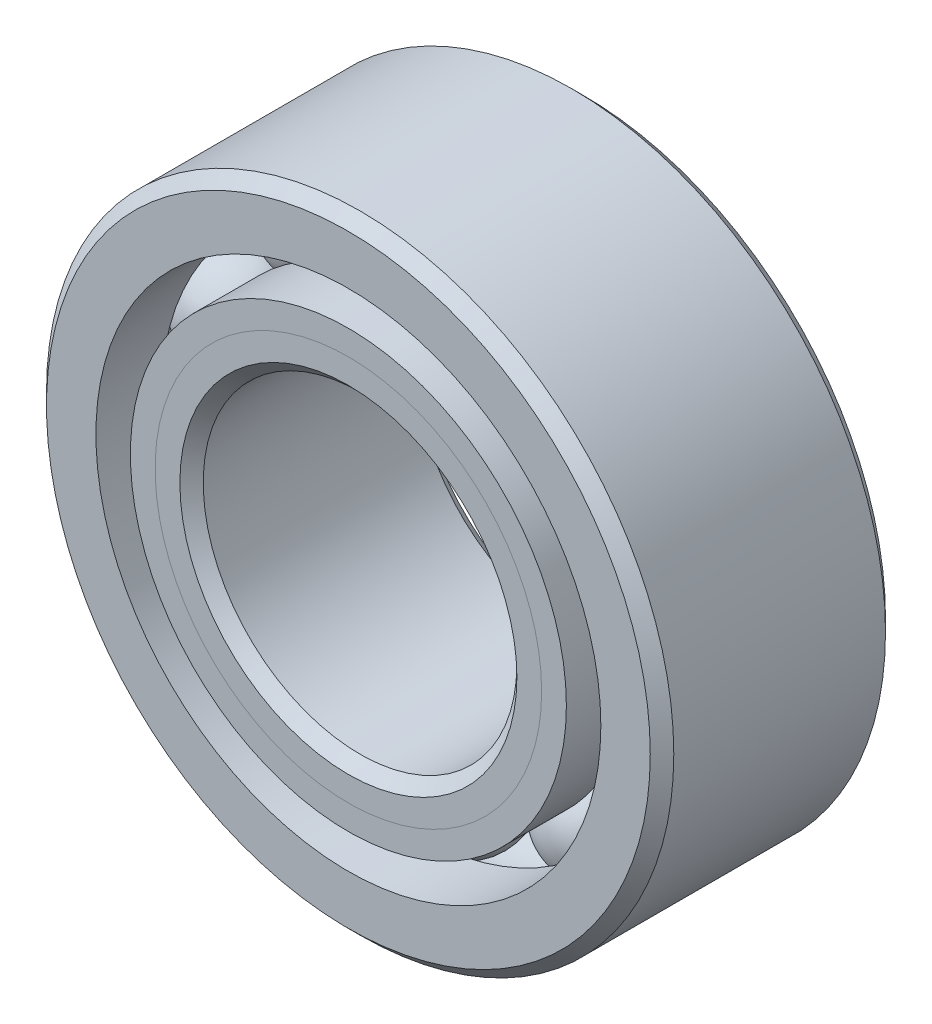
ISO-10303-21;
HEADER;
FILE_DESCRIPTION(('STEP AP214'),'2;1');
FILE_NAME('part.step','',(''),(''),'','','');
FILE_SCHEMA(('AUTOMOTIVE_DESIGN { 1 0 10303 214 1 1 1 1 }'));
ENDSEC;
DATA;
#1=APPLICATION_CONTEXT('core data for automotive mechanical design processes');
#2=APPLICATION_PROTOCOL_DEFINITION('international standard','automotive_design',2000,#1);
#3=PRODUCT_CONTEXT('',#1,'mechanical');
#4=PRODUCT('Part','Part','',(#3));
#5=PRODUCT_RELATED_PRODUCT_CATEGORY('part','',(#4));
#6=PRODUCT_DEFINITION_FORMATION('','',#4);
#7=PRODUCT_DEFINITION_CONTEXT('part definition',#1,'design');
#8=PRODUCT_DEFINITION('design','',#6,#7);
#9=PRODUCT_DEFINITION_SHAPE('','',#8);
#10=(LENGTH_UNIT() NAMED_UNIT(*) SI_UNIT(.MILLI.,.METRE.));
#11=(NAMED_UNIT(*) PLANE_ANGLE_UNIT() SI_UNIT($,.RADIAN.));
#12=(NAMED_UNIT(*) SI_UNIT($,.STERADIAN.) SOLID_ANGLE_UNIT());
#13=UNCERTAINTY_MEASURE_WITH_UNIT(LENGTH_MEASURE(1.E-05),#10,'distance_accuracy_value','');
#14=(GEOMETRIC_REPRESENTATION_CONTEXT(3) GLOBAL_UNCERTAINTY_ASSIGNED_CONTEXT((#13)) GLOBAL_UNIT_ASSIGNED_CONTEXT((#10,
#11,#12)) REPRESENTATION_CONTEXT('',''));
#15=CARTESIAN_POINT('',(0.,0.,0.));
#16=DIRECTION('',(0.,0.,1.));
#17=DIRECTION('',(1.,0.,0.));
#18=AXIS2_PLACEMENT_3D('',#15,#16,#17);
#19=CARTESIAN_POINT('',(-1.39966363202143,1.92647171785536,0.));
#20=DIRECTION('',(0.,0.,1.));
#21=DIRECTION('',(-0.587785252292462,0.809016994374955,0.));
#22=AXIS2_PLACEMENT_3D('',#19,#20,#21);
#23=SPHERICAL_SURFACE('',#22,0.557180720515983);
#24=CARTESIAN_POINT('',(-1.39966363202143,1.92647171785536,0.557180720515982));
#25=VERTEX_POINT('',#24);
#26=VERTEX_LOOP('',#25);
#27=FACE_BOUND('',#26,.T.);
#28=ADVANCED_FACE('F46',(#27),#23,.T.);
#29=CLOSED_SHELL('',(#28));
#30=MANIFOLD_SOLID_BREP('B2',#29);
#31=CARTESIAN_POINT('',(-2.26470332942783,0.735846717855369,0.));
#32=DIRECTION('',(0.,0.,1.));
#33=DIRECTION('',(-0.95105651629515,0.309016994374958,0.));
#34=AXIS2_PLACEMENT_3D('',#31,#32,#33);
#35=SPHERICAL_SURFACE('',#34,0.557180720515983);
#36=CARTESIAN_POINT('',(-2.26470332942783,0.735846717855369,0.557180720515982));
#37=VERTEX_POINT('',#36);
#38=VERTEX_LOOP('',#37);
#39=FACE_BOUND('',#38,.T.);
#40=ADVANCED_FACE('F83',(#39),#35,.T.);
#41=CLOSED_SHELL('',(#40));
#42=MANIFOLD_SOLID_BREP('B6',#41);
#43=CARTESIAN_POINT('',(-2.26470332942784,-0.735846717855322,0.));
#44=DIRECTION('',(0.,0.,1.));
#45=DIRECTION('',(-0.951056516295157,-0.309016994374938,0.));
#46=AXIS2_PLACEMENT_3D('',#43,#44,#45);
#47=SPHERICAL_SURFACE('',#46,0.557180720515983);
#48=CARTESIAN_POINT('',(-2.26470332942784,-0.735846717855322,0.557180720515982));
#49=VERTEX_POINT('',#48);
#50=VERTEX_LOOP('',#49);
#51=FACE_BOUND('',#50,.T.);
#52=ADVANCED_FACE('F120',(#51),#47,.T.);
#53=CLOSED_SHELL('',(#52));
#54=MANIFOLD_SOLID_BREP('B42',#53);
#55=CARTESIAN_POINT('',(-1.39966363202147,-1.92647171785533,0.));
#56=DIRECTION('',(0.,0.,1.));
#57=DIRECTION('',(-0.58778525229248,-0.809016994374942,0.));
#58=AXIS2_PLACEMENT_3D('',#55,#56,#57);
#59=SPHERICAL_SURFACE('',#58,0.557180720515983);
#60=CARTESIAN_POINT('',(-1.39966363202147,-1.92647171785533,0.557180720515982));
#61=VERTEX_POINT('',#60);
#62=VERTEX_LOOP('',#61);
#63=FACE_BOUND('',#62,.T.);
#64=ADVANCED_FACE('F157',(#63),#59,.T.);
#65=CLOSED_SHELL('',(#64));
#66=MANIFOLD_SOLID_BREP('B79',#65);
#67=CARTESIAN_POINT('',(0.,-2.38125,0.));
#68=DIRECTION('',(0.,0.,1.));
#69=DIRECTION('',(0.,-1.,0.));
#70=AXIS2_PLACEMENT_3D('',#67,#68,#69);
#71=SPHERICAL_SURFACE('',#70,0.557180720515983);
#72=CARTESIAN_POINT('',(0.,-2.38125,0.557180720515982));
#73=VERTEX_POINT('',#72);
#74=VERTEX_LOOP('',#73);
#75=FACE_BOUND('',#74,.T.);
#76=ADVANCED_FACE('F194',(#75),#71,.T.);
#77=CLOSED_SHELL('',(#76));
#78=MANIFOLD_SOLID_BREP('B116',#77);
#79=CARTESIAN_POINT('',(1.39966363202144,-1.92647171785535,0.));
#80=DIRECTION('',(0.,0.,1.));
#81=DIRECTION('',(0.587785252292469,-0.809016994374951,0.));
#82=AXIS2_PLACEMENT_3D('',#79,#80,#81);
#83=SPHERICAL_SURFACE('',#82,0.557180720515983);
#84=CARTESIAN_POINT('',(1.39966363202144,-1.92647171785535,0.557180720515982));
#85=VERTEX_POINT('',#84);
#86=VERTEX_LOOP('',#85);
#87=FACE_BOUND('',#86,.T.);
#88=ADVANCED_FACE('F231',(#87),#83,.T.);
#89=CLOSED_SHELL('',(#88));
#90=MANIFOLD_SOLID_BREP('B153',#89);
#91=CARTESIAN_POINT('',(2.26470332942783,-0.735846717855353,0.));
#92=DIRECTION('',(0.,0.,1.));
#93=DIRECTION('',(0.951056516295152,-0.309016994374952,0.));
#94=AXIS2_PLACEMENT_3D('',#91,#92,#93);
#95=SPHERICAL_SURFACE('',#94,0.557180720515983);
#96=CARTESIAN_POINT('',(2.26470332942783,-0.735846717855353,0.557180720515982));
#97=VERTEX_POINT('',#96);
#98=VERTEX_LOOP('',#97);
#99=FACE_BOUND('',#98,.T.);
#100=ADVANCED_FACE('F268',(#99),#95,.T.);
#101=CLOSED_SHELL('',(#100));
#102=MANIFOLD_SOLID_BREP('B190',#101);
#103=CARTESIAN_POINT('',(2.26470332942784,0.735846717855337,0.));
#104=DIRECTION('',(0.,0.,1.));
#105=DIRECTION('',(0.951056516295155,0.309016994374945,0.));
#106=AXIS2_PLACEMENT_3D('',#103,#104,#105);
#107=SPHERICAL_SURFACE('',#106,0.557180720515983);
#108=CARTESIAN_POINT('',(2.26470332942784,0.735846717855337,0.557180720515982));
#109=VERTEX_POINT('',#108);
#110=VERTEX_LOOP('',#109);
#111=FACE_BOUND('',#110,.T.);
#112=ADVANCED_FACE('F305',(#111),#107,.T.);
#113=CLOSED_SHELL('',(#112));
#114=MANIFOLD_SOLID_BREP('B227',#113);
#115=CARTESIAN_POINT('',(1.39966363202145,1.92647171785534,0.));
#116=DIRECTION('',(0.,0.,1.));
#117=DIRECTION('',(0.587785252292474,0.809016994374947,0.));
#118=AXIS2_PLACEMENT_3D('',#115,#116,#117);
#119=SPHERICAL_SURFACE('',#118,0.557180720515983);
#120=CARTESIAN_POINT('',(1.39966363202145,1.92647171785534,0.557180720515982));
#121=VERTEX_POINT('',#120);
#122=VERTEX_LOOP('',#121);
#123=FACE_BOUND('',#122,.T.);
#124=ADVANCED_FACE('F342',(#123),#119,.T.);
#125=CLOSED_SHELL('',(#124));
#126=MANIFOLD_SOLID_BREP('B264',#125);
#127=CARTESIAN_POINT('',(0.,2.38125,0.));
#128=DIRECTION('',(0.,0.,1.));
#129=DIRECTION('',(0.,1.,0.));
#130=AXIS2_PLACEMENT_3D('',#127,#128,#129);
#131=SPHERICAL_SURFACE('',#130,0.557180720515983);
#132=CARTESIAN_POINT('',(0.,2.38125,0.557180720515982));
#133=VERTEX_POINT('',#132);
#134=VERTEX_LOOP('',#133);
#135=FACE_BOUND('',#134,.T.);
#136=ADVANCED_FACE('F381',(#135),#131,.T.);
#137=CLOSED_SHELL('',(#136));
#138=MANIFOLD_SOLID_BREP('B301',#137);
#139=CARTESIAN_POINT('',(0.,1.95629204514573,1.190625));
#140=DIRECTION('',(0.,0.,-1.));
#141=DIRECTION('',(-1.,0.,0.));
#142=AXIS2_PLACEMENT_3D('',#139,#140,#141);
#143=PLANE('',#142);
#144=CARTESIAN_POINT('',(0.,0.,1.190625));
#145=DIRECTION('',(0.,0.,1.));
#146=DIRECTION('',(1.,0.,0.));
#147=AXIS2_PLACEMENT_3D('',#144,#145,#146);
#148=CIRCLE('',#147,1.70578463974201);
#149=CARTESIAN_POINT('',(1.70578463974201,0.,1.190625));
#150=VERTEX_POINT('',#149);
#151=EDGE_CURVE('E447',#150,#150,#148,.T.);
#152=ORIENTED_EDGE('',*,*,#151,.F.);
#153=EDGE_LOOP('',(#152));
#154=FACE_BOUND('',#153,.T.);
#155=CARTESIAN_POINT('',(0.,0.,1.190625));
#156=DIRECTION('',(0.,0.,1.));
#157=DIRECTION('',(1.,0.,0.));
#158=AXIS2_PLACEMENT_3D('',#155,#156,#157);
#159=CIRCLE('',#158,1.95629204514573);
#160=CARTESIAN_POINT('',(1.95629204514573,0.,1.190625));
#161=VERTEX_POINT('',#160);
#162=EDGE_CURVE('E380',#161,#161,#159,.T.);
#163=ORIENTED_EDGE('',*,*,#162,.T.);
#164=EDGE_LOOP('',(#163));
#165=FACE_BOUND('',#164,.T.);
#166=ADVANCED_FACE('F402',(#154,#165),#143,.F.);
#167=CARTESIAN_POINT('',(0.,0.,0.940117594596281));
#168=DIRECTION('',(0.,0.,1.));
#169=DIRECTION('',(1.,0.,0.));
#170=AXIS2_PLACEMENT_3D('',#167,#168,#169);
#171=CONICAL_SURFACE('',#170,1.70578463974201,0.78539816339745);
#172=ORIENTED_EDGE('',*,*,#162,.F.);
#173=EDGE_LOOP('',(#172));
#174=FACE_BOUND('',#173,.T.);
#175=CARTESIAN_POINT('',(0.,0.,0.940117594596281));
#176=DIRECTION('',(0.,0.,1.));
#177=DIRECTION('',(1.,0.,0.));
#178=AXIS2_PLACEMENT_3D('',#175,#176,#177);
#179=CIRCLE('',#178,1.70578463974201);
#180=CARTESIAN_POINT('',(1.70578463974201,0.,0.940117594596281));
#181=VERTEX_POINT('',#180);
#182=EDGE_CURVE('E409',#181,#181,#179,.T.);
#183=ORIENTED_EDGE('',*,*,#182,.T.);
#184=EDGE_LOOP('',(#183));
#185=FACE_BOUND('',#184,.T.);
#186=ADVANCED_FACE('F456',(#174,#185),#171,.T.);
#187=CARTESIAN_POINT('',(0.,0.,1.190625));
#188=DIRECTION('',(0.,0.,1.));
#189=DIRECTION('',(1.,0.,0.));
#190=AXIS2_PLACEMENT_3D('',#187,#188,#189);
#191=CYLINDRICAL_SURFACE('',#190,1.70578463974201);
#192=ORIENTED_EDGE('',*,*,#182,.F.);
#193=EDGE_LOOP('',(#192));
#194=FACE_BOUND('',#193,.T.);
#195=CARTESIAN_POINT('',(0.,0.,0.));
#196=DIRECTION('',(0.,0.,1.));
#197=DIRECTION('',(1.,0.,0.));
#198=AXIS2_PLACEMENT_3D('',#195,#196,#197);
#199=CIRCLE('',#198,1.70578463974201);
#200=CARTESIAN_POINT('',(1.70578463974201,0.,0.));
#201=VERTEX_POINT('',#200);
#202=EDGE_CURVE('E415',#201,#201,#199,.T.);
#203=ORIENTED_EDGE('',*,*,#202,.T.);
#204=EDGE_LOOP('',(#203));
#205=FACE_BOUND('',#204,.T.);
#206=ADVANCED_FACE('F460',(#194,#205),#191,.T.);
#207=CARTESIAN_POINT('',(0.,1.70578463974201,0.));
#208=DIRECTION('',(0.,0.,-1.));
#209=DIRECTION('',(-1.,0.,0.));
#210=AXIS2_PLACEMENT_3D('',#207,#208,#209);
#211=PLANE('',#210);
#212=ORIENTED_EDGE('',*,*,#202,.F.);
#213=EDGE_LOOP('',(#212));
#214=FACE_BOUND('',#213,.T.);
#215=CARTESIAN_POINT('',(0.,0.,0.));
#216=DIRECTION('',(0.,0.,1.));
#217=DIRECTION('',(1.,0.,0.));
#218=AXIS2_PLACEMENT_3D('',#215,#216,#217);
#219=CIRCLE('',#218,1.82406927948402);
#220=CARTESIAN_POINT('',(1.82406927948402,0.,0.));
#221=VERTEX_POINT('',#220);
#222=EDGE_CURVE('E421',#221,#221,#219,.T.);
#223=ORIENTED_EDGE('',*,*,#222,.T.);
#224=EDGE_LOOP('',(#223));
#225=FACE_BOUND('',#224,.T.);
#226=ADVANCED_FACE('F465',(#214,#225),#211,.F.);
#227=CARTESIAN_POINT('',(0.,0.,0.));
#228=DIRECTION('',(0.,0.,1.));
#229=DIRECTION('',(1.,0.,0.));
#230=AXIS2_PLACEMENT_3D('',#227,#228,#229);
#231=TOROIDAL_SURFACE('',#230,2.38125,0.557180720515982);
#232=ORIENTED_EDGE('',*,*,#222,.F.);
#233=EDGE_LOOP('',(#232));
#234=FACE_BOUND('',#233,.T.);
#235=CARTESIAN_POINT('',(0.,0.,-0.529166666666667));
#236=DIRECTION('',(0.,0.,1.));
#237=DIRECTION('',(1.,0.,0.));
#238=AXIS2_PLACEMENT_3D('',#235,#236,#237);
#239=CIRCLE('',#238,2.20679945054945);
#240=CARTESIAN_POINT('',(2.20679945054945,0.,-0.529166666666667));
#241=VERTEX_POINT('',#240);
#242=EDGE_CURVE('E427',#241,#241,#239,.T.);
#243=ORIENTED_EDGE('',*,*,#242,.T.);
#244=EDGE_LOOP('',(#243));
#245=FACE_BOUND('',#244,.T.);
#246=ADVANCED_FACE('F471',(#234,#245),#231,.F.);
#247=CARTESIAN_POINT('',(0.,0.,1.190625));
#248=DIRECTION('',(0.,0.,1.));
#249=DIRECTION('',(1.,0.,0.));
#250=AXIS2_PLACEMENT_3D('',#247,#248,#249);
#251=CYLINDRICAL_SURFACE('',#250,2.20679945054945);
#252=ORIENTED_EDGE('',*,*,#242,.F.);
#253=EDGE_LOOP('',(#252));
#254=FACE_BOUND('',#253,.T.);
#255=CARTESIAN_POINT('',(0.,0.,-1.190625));
#256=DIRECTION('',(0.,0.,1.));
#257=DIRECTION('',(1.,0.,0.));
#258=AXIS2_PLACEMENT_3D('',#255,#256,#257);
#259=CIRCLE('',#258,2.20679945054945);
#260=CARTESIAN_POINT('',(2.20679945054945,0.,-1.190625));
#261=VERTEX_POINT('',#260);
#262=EDGE_CURVE('E431',#261,#261,#259,.T.);
#263=ORIENTED_EDGE('',*,*,#262,.T.);
#264=EDGE_LOOP('',(#263));
#265=FACE_BOUND('',#264,.T.);
#266=ADVANCED_FACE('F475',(#254,#265),#251,.T.);
#267=CARTESIAN_POINT('',(0.,1.7065625,-1.190625));
#268=DIRECTION('',(0.,0.,1.));
#269=DIRECTION('',(1.,0.,0.));
#270=AXIS2_PLACEMENT_3D('',#267,#268,#269);
#271=PLANE('',#270);
#272=ORIENTED_EDGE('',*,*,#262,.F.);
#273=EDGE_LOOP('',(#272));
#274=FACE_BOUND('',#273,.T.);
#275=CARTESIAN_POINT('',(0.,0.,-1.190625));
#276=DIRECTION('',(0.,0.,1.));
#277=DIRECTION('',(1.,0.,0.));
#278=AXIS2_PLACEMENT_3D('',#275,#276,#277);
#279=CIRCLE('',#278,1.7065625);
#280=CARTESIAN_POINT('',(1.7065625,0.,-1.190625));
#281=VERTEX_POINT('',#280);
#282=EDGE_CURVE('E435',#281,#281,#279,.T.);
#283=ORIENTED_EDGE('',*,*,#282,.T.);
#284=EDGE_LOOP('',(#283));
#285=FACE_BOUND('',#284,.T.);
#286=ADVANCED_FACE('F479',(#274,#285),#271,.F.);
#287=CARTESIAN_POINT('',(0.,0.,-1.0715625));
#288=DIRECTION('',(0.,0.,-1.));
#289=DIRECTION('',(-1.,0.,0.));
#290=AXIS2_PLACEMENT_3D('',#287,#288,#289);
#291=CONICAL_SURFACE('',#290,1.5875,0.785398163397448);
#292=ORIENTED_EDGE('',*,*,#282,.F.);
#293=EDGE_LOOP('',(#292));
#294=FACE_BOUND('',#293,.T.);
#295=CARTESIAN_POINT('',(0.,0.,-1.0715625));
#296=DIRECTION('',(0.,0.,1.));
#297=DIRECTION('',(1.,0.,0.));
#298=AXIS2_PLACEMENT_3D('',#295,#296,#297);
#299=CIRCLE('',#298,1.5875);
#300=CARTESIAN_POINT('',(1.5875,0.,-1.0715625));
#301=VERTEX_POINT('',#300);
#302=EDGE_CURVE('E439',#301,#301,#299,.T.);
#303=ORIENTED_EDGE('',*,*,#302,.T.);
#304=EDGE_LOOP('',(#303));
#305=FACE_BOUND('',#304,.T.);
#306=ADVANCED_FACE('F483',(#294,#305),#291,.F.);
#307=CARTESIAN_POINT('',(0.,0.,1.190625));
#308=DIRECTION('',(0.,0.,1.));
#309=DIRECTION('',(1.,0.,0.));
#310=AXIS2_PLACEMENT_3D('',#307,#308,#309);
#311=CYLINDRICAL_SURFACE('',#310,1.5875);
#312=ORIENTED_EDGE('',*,*,#302,.F.);
#313=EDGE_LOOP('',(#312));
#314=FACE_BOUND('',#313,.T.);
#315=CARTESIAN_POINT('',(0.,0.,1.07234036025799));
#316=DIRECTION('',(0.,0.,1.));
#317=DIRECTION('',(1.,0.,0.));
#318=AXIS2_PLACEMENT_3D('',#315,#316,#317);
#319=CIRCLE('',#318,1.5875);
#320=CARTESIAN_POINT('',(1.5875,0.,1.07234036025799));
#321=VERTEX_POINT('',#320);
#322=EDGE_CURVE('E443',#321,#321,#319,.T.);
#323=ORIENTED_EDGE('',*,*,#322,.T.);
#324=EDGE_LOOP('',(#323));
#325=FACE_BOUND('',#324,.T.);
#326=ADVANCED_FACE('F487',(#314,#325),#311,.F.);
#327=CARTESIAN_POINT('',(0.,0.,1.190625));
#328=DIRECTION('',(0.,0.,1.));
#329=DIRECTION('',(1.,0.,0.));
#330=AXIS2_PLACEMENT_3D('',#327,#328,#329);
#331=CONICAL_SURFACE('',#330,1.70578463974201,0.78539816339745);
#332=ORIENTED_EDGE('',*,*,#322,.F.);
#333=EDGE_LOOP('',(#332));
#334=FACE_BOUND('',#333,.T.);
#335=ORIENTED_EDGE('',*,*,#151,.T.);
#336=EDGE_LOOP('',(#335));
#337=FACE_BOUND('',#336,.T.);
#338=ADVANCED_FACE('F453',(#334,#337),#331,.F.);
#339=CLOSED_SHELL('',(#166,#186,#206,#226,#246,#266,#286,#306,#326,#338));
#340=MANIFOLD_SOLID_BREP('B338',#339);
#341=CARTESIAN_POINT('',(0.,2.20679945054945,1.190625));
#342=DIRECTION('',(0.,0.,-1.));
#343=DIRECTION('',(-1.,0.,0.));
#344=AXIS2_PLACEMENT_3D('',#341,#342,#343);
#345=PLANE('',#344);
#346=CARTESIAN_POINT('',(0.,0.,1.190625));
#347=DIRECTION('',(0.,0.,1.));
#348=DIRECTION('',(1.,0.,0.));
#349=AXIS2_PLACEMENT_3D('',#346,#347,#348);
#350=CIRCLE('',#349,1.95629204514573);
#351=CARTESIAN_POINT('',(1.95629204514573,0.,1.190625));
#352=VERTEX_POINT('',#351);
#353=EDGE_CURVE('E401',#352,#352,#350,.T.);
#354=ORIENTED_EDGE('',*,*,#353,.F.);
#355=EDGE_LOOP('',(#354));
#356=FACE_BOUND('',#355,.T.);
#357=CARTESIAN_POINT('',(0.,0.,1.190625));
#358=DIRECTION('',(0.,0.,1.));
#359=DIRECTION('',(1.,0.,0.));
#360=AXIS2_PLACEMENT_3D('',#357,#358,#359);
#361=CIRCLE('',#360,2.20679945054945);
#362=CARTESIAN_POINT('',(2.20679945054945,0.,1.190625));
#363=VERTEX_POINT('',#362);
#364=EDGE_CURVE('E610',#363,#363,#361,.T.);
#365=ORIENTED_EDGE('',*,*,#364,.T.);
#366=EDGE_LOOP('',(#365));
#367=FACE_BOUND('',#366,.T.);
#368=ADVANCED_FACE('F581',(#356,#367),#345,.F.);
#369=CARTESIAN_POINT('',(0.,0.,1.190625));
#370=DIRECTION('',(0.,0.,1.));
#371=DIRECTION('',(1.,0.,0.));
#372=AXIS2_PLACEMENT_3D('',#369,#370,#371);
#373=CONICAL_SURFACE('',#372,1.95629204514573,0.78539816339745);
#374=CARTESIAN_POINT('',(0.,0.,0.940117594596281));
#375=DIRECTION('',(0.,0.,1.));
#376=DIRECTION('',(1.,0.,0.));
#377=AXIS2_PLACEMENT_3D('',#374,#375,#376);
#378=CIRCLE('',#377,1.70578463974201);
#379=CARTESIAN_POINT('',(1.70578463974201,0.,0.940117594596281));
#380=VERTEX_POINT('',#379);
#381=EDGE_CURVE('E588',#380,#380,#378,.T.);
#382=ORIENTED_EDGE('',*,*,#381,.F.);
#383=EDGE_LOOP('',(#382));
#384=FACE_BOUND('',#383,.T.);
#385=ORIENTED_EDGE('',*,*,#353,.T.);
#386=EDGE_LOOP('',(#385));
#387=FACE_BOUND('',#386,.T.);
#388=ADVANCED_FACE('F637',(#384,#387),#373,.F.);
#389=CARTESIAN_POINT('',(0.,0.,1.190625));
#390=DIRECTION('',(0.,0.,1.));
#391=DIRECTION('',(1.,0.,0.));
#392=AXIS2_PLACEMENT_3D('',#389,#390,#391);
#393=CYLINDRICAL_SURFACE('',#392,1.70578463974201);
#394=CARTESIAN_POINT('',(0.,0.,0.));
#395=DIRECTION('',(0.,0.,1.));
#396=DIRECTION('',(1.,0.,0.));
#397=AXIS2_PLACEMENT_3D('',#394,#395,#396);
#398=CIRCLE('',#397,1.70578463974201);
#399=CARTESIAN_POINT('',(1.70578463974201,0.,0.));
#400=VERTEX_POINT('',#399);
#401=EDGE_CURVE('E594',#400,#400,#398,.T.);
#402=ORIENTED_EDGE('',*,*,#401,.F.);
#403=EDGE_LOOP('',(#402));
#404=FACE_BOUND('',#403,.T.);
#405=ORIENTED_EDGE('',*,*,#381,.T.);
#406=EDGE_LOOP('',(#405));
#407=FACE_BOUND('',#406,.T.);
#408=ADVANCED_FACE('F632',(#404,#407),#393,.F.);
#409=CARTESIAN_POINT('',(0.,1.70578463974201,0.));
#410=DIRECTION('',(0.,0.,1.));
#411=DIRECTION('',(1.,0.,0.));
#412=AXIS2_PLACEMENT_3D('',#409,#410,#411);
#413=PLANE('',#412);
#414=CARTESIAN_POINT('',(0.,0.,0.));
#415=DIRECTION('',(0.,0.,1.));
#416=DIRECTION('',(1.,0.,0.));
#417=AXIS2_PLACEMENT_3D('',#414,#415,#416);
#418=CIRCLE('',#417,1.82406927948402);
#419=CARTESIAN_POINT('',(1.82406927948402,0.,0.));
#420=VERTEX_POINT('',#419);
#421=EDGE_CURVE('E600',#420,#420,#418,.T.);
#422=ORIENTED_EDGE('',*,*,#421,.F.);
#423=EDGE_LOOP('',(#422));
#424=FACE_BOUND('',#423,.T.);
#425=ORIENTED_EDGE('',*,*,#401,.T.);
#426=EDGE_LOOP('',(#425));
#427=FACE_BOUND('',#426,.T.);
#428=ADVANCED_FACE('F626',(#424,#427),#413,.F.);
#429=CARTESIAN_POINT('',(0.,0.,0.));
#430=DIRECTION('',(0.,0.,1.));
#431=DIRECTION('',(1.,0.,0.));
#432=AXIS2_PLACEMENT_3D('',#429,#430,#431);
#433=TOROIDAL_SURFACE('',#432,2.38125,0.557180720515983);
#434=CARTESIAN_POINT('',(0.,0.,0.529166666666666));
#435=DIRECTION('',(0.,0.,1.));
#436=DIRECTION('',(1.,0.,0.));
#437=AXIS2_PLACEMENT_3D('',#434,#435,#436);
#438=CIRCLE('',#437,2.20679945054945);
#439=CARTESIAN_POINT('',(2.20679945054945,0.,0.529166666666666));
#440=VERTEX_POINT('',#439);
#441=EDGE_CURVE('E606',#440,#440,#438,.T.);
#442=ORIENTED_EDGE('',*,*,#441,.F.);
#443=EDGE_LOOP('',(#442));
#444=FACE_BOUND('',#443,.T.);
#445=ORIENTED_EDGE('',*,*,#421,.T.);
#446=EDGE_LOOP('',(#445));
#447=FACE_BOUND('',#446,.T.);
#448=ADVANCED_FACE('F620',(#444,#447),#433,.F.);
#449=CARTESIAN_POINT('',(0.,0.,1.190625));
#450=DIRECTION('',(0.,0.,1.));
#451=DIRECTION('',(1.,0.,0.));
#452=AXIS2_PLACEMENT_3D('',#449,#450,#451);
#453=CYLINDRICAL_SURFACE('',#452,2.20679945054945);
#454=ORIENTED_EDGE('',*,*,#364,.F.);
#455=EDGE_LOOP('',(#454));
#456=FACE_BOUND('',#455,.T.);
#457=ORIENTED_EDGE('',*,*,#441,.T.);
#458=EDGE_LOOP('',(#457));
#459=FACE_BOUND('',#458,.T.);
#460=ADVANCED_FACE('F617',(#456,#459),#453,.T.);
#461=CLOSED_SHELL('',(#368,#388,#408,#428,#448,#460));
#462=MANIFOLD_SOLID_BREP('B375',#461);
#463=CARTESIAN_POINT('',(0.,0.,1.0715625));
#464=DIRECTION('',(0.,0.,-1.));
#465=DIRECTION('',(-1.,0.,0.));
#466=AXIS2_PLACEMENT_3D('',#463,#464,#465);
#467=CONICAL_SURFACE('',#466,3.175,0.785398163397449);
#468=CARTESIAN_POINT('',(0.,0.,1.190625));
#469=DIRECTION('',(0.,0.,1.));
#470=DIRECTION('',(1.,0.,0.));
#471=AXIS2_PLACEMENT_3D('',#468,#469,#470);
#472=CIRCLE('',#471,3.0559375);
#473=CARTESIAN_POINT('',(3.0559375,0.,1.190625));
#474=VERTEX_POINT('',#473);
#475=EDGE_CURVE('E722',#474,#474,#472,.T.);
#476=ORIENTED_EDGE('',*,*,#475,.F.);
#477=EDGE_LOOP('',(#476));
#478=FACE_BOUND('',#477,.T.);
#479=CARTESIAN_POINT('',(0.,0.,1.0715625));
#480=DIRECTION('',(0.,0.,1.));
#481=DIRECTION('',(1.,0.,0.));
#482=AXIS2_PLACEMENT_3D('',#479,#480,#481);
#483=CIRCLE('',#482,3.175);
#484=CARTESIAN_POINT('',(3.175,0.,1.0715625));
#485=VERTEX_POINT('',#484);
#486=EDGE_CURVE('E580',#485,#485,#483,.T.);
#487=ORIENTED_EDGE('',*,*,#486,.T.);
#488=EDGE_LOOP('',(#487));
#489=FACE_BOUND('',#488,.T.);
#490=ADVANCED_FACE('F685',(#478,#489),#467,.T.);
#491=CARTESIAN_POINT('',(0.,0.,1.190625));
#492=DIRECTION('',(0.,0.,1.));
#493=DIRECTION('',(1.,0.,0.));
#494=AXIS2_PLACEMENT_3D('',#491,#492,#493);
#495=CYLINDRICAL_SURFACE('',#494,3.175);
#496=ORIENTED_EDGE('',*,*,#486,.F.);
#497=EDGE_LOOP('',(#496));
#498=FACE_BOUND('',#497,.T.);
#499=CARTESIAN_POINT('',(0.,0.,-1.0715625));
#500=DIRECTION('',(0.,0.,1.));
#501=DIRECTION('',(1.,0.,0.));
#502=AXIS2_PLACEMENT_3D('',#499,#500,#501);
#503=CIRCLE('',#502,3.175);
#504=CARTESIAN_POINT('',(3.175,0.,-1.0715625));
#505=VERTEX_POINT('',#504);
#506=EDGE_CURVE('E692',#505,#505,#503,.T.);
#507=ORIENTED_EDGE('',*,*,#506,.T.);
#508=EDGE_LOOP('',(#507));
#509=FACE_BOUND('',#508,.T.);
#510=ADVANCED_FACE('F731',(#498,#509),#495,.T.);
#511=CARTESIAN_POINT('',(0.,0.,-1.190625));
#512=DIRECTION('',(0.,0.,1.));
#513=DIRECTION('',(1.,0.,0.));
#514=AXIS2_PLACEMENT_3D('',#511,#512,#513);
#515=CONICAL_SURFACE('',#514,3.0559375,0.785398163397448);
#516=ORIENTED_EDGE('',*,*,#506,.F.);
#517=EDGE_LOOP('',(#516));
#518=FACE_BOUND('',#517,.T.);
#519=CARTESIAN_POINT('',(0.,0.,-1.190625));
#520=DIRECTION('',(0.,0.,1.));
#521=DIRECTION('',(1.,0.,0.));
#522=AXIS2_PLACEMENT_3D('',#519,#520,#521);
#523=CIRCLE('',#522,3.0559375);
#524=CARTESIAN_POINT('',(3.0559375,0.,-1.190625));
#525=VERTEX_POINT('',#524);
#526=EDGE_CURVE('E698',#525,#525,#523,.T.);
#527=ORIENTED_EDGE('',*,*,#526,.T.);
#528=EDGE_LOOP('',(#527));
#529=FACE_BOUND('',#528,.T.);
#530=ADVANCED_FACE('F735',(#518,#529),#515,.T.);
#531=CARTESIAN_POINT('',(0.,3.0559375,-1.190625));
#532=DIRECTION('',(0.,0.,1.));
#533=DIRECTION('',(1.,0.,0.));
#534=AXIS2_PLACEMENT_3D('',#531,#532,#533);
#535=PLANE('',#534);
#536=ORIENTED_EDGE('',*,*,#526,.F.);
#537=EDGE_LOOP('',(#536));
#538=FACE_BOUND('',#537,.T.);
#539=CARTESIAN_POINT('',(0.,0.,-1.190625));
#540=DIRECTION('',(0.,0.,1.));
#541=DIRECTION('',(1.,0.,0.));
#542=AXIS2_PLACEMENT_3D('',#539,#540,#541);
#543=CIRCLE('',#542,2.55570054945055);
#544=CARTESIAN_POINT('',(2.55570054945055,0.,-1.190625));
#545=VERTEX_POINT('',#544);
#546=EDGE_CURVE('E704',#545,#545,#543,.T.);
#547=ORIENTED_EDGE('',*,*,#546,.T.);
#548=EDGE_LOOP('',(#547));
#549=FACE_BOUND('',#548,.T.);
#550=ADVANCED_FACE('F740',(#538,#549),#535,.F.);
#551=CARTESIAN_POINT('',(0.,0.,1.190625));
#552=DIRECTION('',(0.,0.,1.));
#553=DIRECTION('',(1.,0.,0.));
#554=AXIS2_PLACEMENT_3D('',#551,#552,#553);
#555=CYLINDRICAL_SURFACE('',#554,2.55570054945055);
#556=ORIENTED_EDGE('',*,*,#546,.F.);
#557=EDGE_LOOP('',(#556));
#558=FACE_BOUND('',#557,.T.);
#559=CARTESIAN_POINT('',(0.,0.,-0.529166666666667));
#560=DIRECTION('',(0.,0.,1.));
#561=DIRECTION('',(1.,0.,0.));
#562=AXIS2_PLACEMENT_3D('',#559,#560,#561);
#563=CIRCLE('',#562,2.55570054945055);
#564=CARTESIAN_POINT('',(2.55570054945055,0.,-0.529166666666667));
#565=VERTEX_POINT('',#564);
#566=EDGE_CURVE('E710',#565,#565,#563,.T.);
#567=ORIENTED_EDGE('',*,*,#566,.T.);
#568=EDGE_LOOP('',(#567));
#569=FACE_BOUND('',#568,.T.);
#570=ADVANCED_FACE('F746',(#558,#569),#555,.F.);
#571=CARTESIAN_POINT('',(0.,0.,0.));
#572=DIRECTION('',(0.,0.,1.));
#573=DIRECTION('',(1.,0.,0.));
#574=AXIS2_PLACEMENT_3D('',#571,#572,#573);
#575=TOROIDAL_SURFACE('',#574,2.38125,0.557180720515983);
#576=ORIENTED_EDGE('',*,*,#566,.F.);
#577=EDGE_LOOP('',(#576));
#578=FACE_BOUND('',#577,.T.);
#579=CARTESIAN_POINT('',(0.,0.,0.529166666666666));
#580=DIRECTION('',(0.,0.,1.));
#581=DIRECTION('',(1.,0.,0.));
#582=AXIS2_PLACEMENT_3D('',#579,#580,#581);
#583=CIRCLE('',#582,2.55570054945055);
#584=CARTESIAN_POINT('',(2.55570054945055,0.,0.529166666666666));
#585=VERTEX_POINT('',#584);
#586=EDGE_CURVE('E714',#585,#585,#583,.T.);
#587=ORIENTED_EDGE('',*,*,#586,.T.);
#588=EDGE_LOOP('',(#587));
#589=FACE_BOUND('',#588,.T.);
#590=ADVANCED_FACE('F750',(#578,#589),#575,.F.);
#591=CARTESIAN_POINT('',(0.,0.,1.190625));
#592=DIRECTION('',(0.,0.,1.));
#593=DIRECTION('',(1.,0.,0.));
#594=AXIS2_PLACEMENT_3D('',#591,#592,#593);
#595=CYLINDRICAL_SURFACE('',#594,2.55570054945055);
#596=ORIENTED_EDGE('',*,*,#586,.F.);
#597=EDGE_LOOP('',(#596));
#598=FACE_BOUND('',#597,.T.);
#599=CARTESIAN_POINT('',(0.,0.,1.190625));
#600=DIRECTION('',(0.,0.,1.));
#601=DIRECTION('',(1.,0.,0.));
#602=AXIS2_PLACEMENT_3D('',#599,#600,#601);
#603=CIRCLE('',#602,2.55570054945055);
#604=CARTESIAN_POINT('',(2.55570054945055,0.,1.190625));
#605=VERTEX_POINT('',#604);
#606=EDGE_CURVE('E718',#605,#605,#603,.T.);
#607=ORIENTED_EDGE('',*,*,#606,.T.);
#608=EDGE_LOOP('',(#607));
#609=FACE_BOUND('',#608,.T.);
#610=ADVANCED_FACE('F754',(#598,#609),#595,.F.);
#611=CARTESIAN_POINT('',(0.,3.0559375,1.190625));
#612=DIRECTION('',(0.,0.,-1.));
#613=DIRECTION('',(-1.,0.,0.));
#614=AXIS2_PLACEMENT_3D('',#611,#612,#613);
#615=PLANE('',#614);
#616=ORIENTED_EDGE('',*,*,#606,.F.);
#617=EDGE_LOOP('',(#616));
#618=FACE_BOUND('',#617,.T.);
#619=ORIENTED_EDGE('',*,*,#475,.T.);
#620=EDGE_LOOP('',(#619));
#621=FACE_BOUND('',#620,.T.);
#622=ADVANCED_FACE('F728',(#618,#621),#615,.F.);
#623=CLOSED_SHELL('',(#490,#510,#530,#550,#570,#590,#610,#622));
#624=MANIFOLD_SOLID_BREP('B396',#623);
#625=ADVANCED_BREP_SHAPE_REPRESENTATION('',(#18,#30,#42,#54,#66,#78,#90,#102,#114,#126,#138,
#340,#462,#624),#14);
#626=SHAPE_DEFINITION_REPRESENTATION(#9,#625);
ENDSEC;
END-ISO-10303-21;
